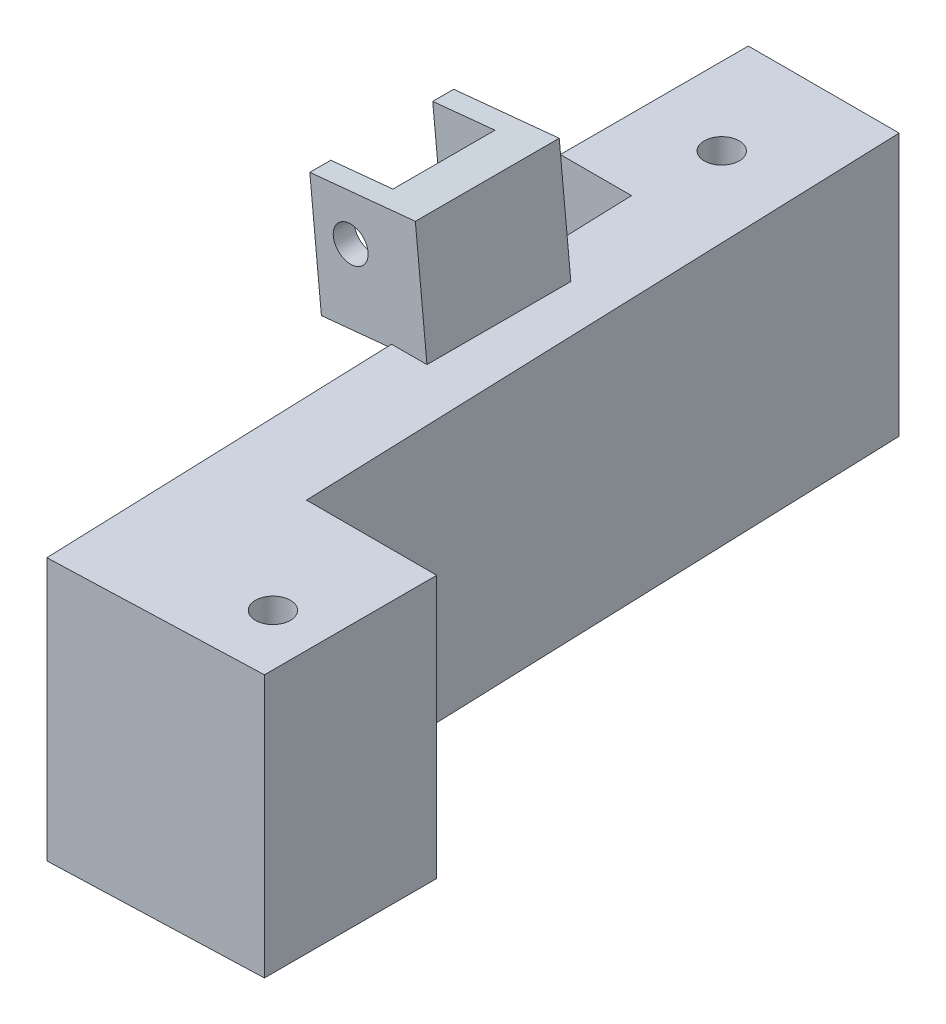
ISO-10303-21;
HEADER;
FILE_DESCRIPTION(('STEP AP214'),'2;1');
FILE_NAME('part.step','',(''),(''),'','','');
FILE_SCHEMA(('AUTOMOTIVE_DESIGN { 1 0 10303 214 1 1 1 1 }'));
ENDSEC;
DATA;
#1=APPLICATION_CONTEXT('core data for automotive mechanical design processes');
#2=APPLICATION_PROTOCOL_DEFINITION('international standard','automotive_design',2000,#1);
#3=PRODUCT_CONTEXT('',#1,'mechanical');
#4=PRODUCT('Part','Part','',(#3));
#5=PRODUCT_RELATED_PRODUCT_CATEGORY('part','',(#4));
#6=PRODUCT_DEFINITION_FORMATION('','',#4);
#7=PRODUCT_DEFINITION_CONTEXT('part definition',#1,'design');
#8=PRODUCT_DEFINITION('design','',#6,#7);
#9=PRODUCT_DEFINITION_SHAPE('','',#8);
#10=(LENGTH_UNIT() NAMED_UNIT(*) SI_UNIT(.MILLI.,.METRE.));
#11=(NAMED_UNIT(*) PLANE_ANGLE_UNIT() SI_UNIT($,.RADIAN.));
#12=(NAMED_UNIT(*) SI_UNIT($,.STERADIAN.) SOLID_ANGLE_UNIT());
#13=UNCERTAINTY_MEASURE_WITH_UNIT(LENGTH_MEASURE(1.E-05),#10,'distance_accuracy_value','');
#14=(GEOMETRIC_REPRESENTATION_CONTEXT(3) GLOBAL_UNCERTAINTY_ASSIGNED_CONTEXT((#13)) GLOBAL_UNIT_ASSIGNED_CONTEXT((#10,
#11,#12)) REPRESENTATION_CONTEXT('',''));
#15=CARTESIAN_POINT('',(0.,0.,0.));
#16=DIRECTION('',(0.,0.,1.));
#17=DIRECTION('',(1.,0.,0.));
#18=AXIS2_PLACEMENT_3D('',#15,#16,#17);
#19=CARTESIAN_POINT('',(484.354931301938,150.999999999998,22.352));
#20=DIRECTION('',(0.,0.,-1.));
#21=DIRECTION('',(1.,0.,0.));
#22=AXIS2_PLACEMENT_3D('',#19,#20,#21);
#23=CYLINDRICAL_SURFACE('',#22,9.52499999999996);
#24=CARTESIAN_POINT('',(484.354931301938,150.999999999998,18.542));
#25=DIRECTION('',(0.,0.,-1.));
#26=DIRECTION('',(-1.,0.,0.));
#27=AXIS2_PLACEMENT_3D('',#24,#25,#26);
#28=CIRCLE('',#27,9.52499999999996);
#29=CARTESIAN_POINT('',(485.284620904235,141.520479851626,18.542));
#30=VERTEX_POINT('',#29);
#31=CARTESIAN_POINT('',(488.231748541954,159.700339825977,18.542));
#32=VERTEX_POINT('',#31);
#33=EDGE_CURVE('E303',#30,#32,#28,.F.);
#34=ORIENTED_EDGE('',*,*,#33,.T.);
#35=DIRECTION('',(0.,0.,-1.));
#36=VECTOR('',#35,1.);
#37=CARTESIAN_POINT('',(488.231748541954,159.700339825977,22.3519999999996));
#38=LINE('',#37,#36);
#39=CARTESIAN_POINT('',(488.231748541954,159.700339825977,-4.44089209850063E-13));
#40=VERTEX_POINT('',#39);
#41=EDGE_CURVE('E339',#32,#40,#38,.T.);
#42=ORIENTED_EDGE('',*,*,#41,.T.);
#43=CARTESIAN_POINT('',(484.354931301938,150.999999999998,0.));
#44=DIRECTION('',(0.,0.,1.));
#45=DIRECTION('',(1.,0.,0.));
#46=AXIS2_PLACEMENT_3D('',#43,#44,#45);
#47=CIRCLE('',#46,9.52499999999996);
#48=CARTESIAN_POINT('',(485.284620904235,141.520479851626,0.));
#49=VERTEX_POINT('',#48);
#50=EDGE_CURVE('E317',#49,#40,#47,.T.);
#51=ORIENTED_EDGE('',*,*,#50,.F.);
#52=DIRECTION('',(0.,0.,-1.));
#53=VECTOR('',#52,1.);
#54=CARTESIAN_POINT('',(485.284620904235,141.520479851626,22.352));
#55=LINE('',#54,#53);
#56=EDGE_CURVE('E332',#30,#49,#55,.T.);
#57=ORIENTED_EDGE('',*,*,#56,.F.);
#58=EDGE_LOOP('',(#34,#42,#51,#57));
#59=FACE_BOUND('',#58,.T.);
#60=ADVANCED_FACE('F49',(#59),#23,.F.);
#61=CARTESIAN_POINT('',(-9.12398287906912,93.0321037493748,22.352));
#62=DIRECTION('',(-0.0976052075901502,0.99522521242746,0.));
#63=DIRECTION('',(-0.99522521242746,-0.0976052075901502,0.));
#64=AXIS2_PLACEMENT_3D('',#61,#62,#63);
#65=PLANE('',#64);
#66=ORIENTED_EDGE('',*,*,#56,.T.);
#67=DIRECTION('',(-0.995225212427461,-0.0976052075901502,0.));
#68=VECTOR('',#67,1.);
#69=CARTESIAN_POINT('',(-9.12398287906912,93.0321037493748,0.));
#70=LINE('',#69,#68);
#71=CARTESIAN_POINT('',(478.661596160572,140.870936716155,0.));
#72=VERTEX_POINT('',#71);
#73=EDGE_CURVE('E322',#49,#72,#70,.T.);
#74=ORIENTED_EDGE('',*,*,#73,.T.);
#75=DIRECTION('',(0.,0.,-1.));
#76=VECTOR('',#75,1.);
#77=CARTESIAN_POINT('',(478.661596160572,140.870936716155,22.352));
#78=LINE('',#77,#76);
#79=CARTESIAN_POINT('',(478.661596160572,140.870936716155,18.542));
#80=VERTEX_POINT('',#79);
#81=EDGE_CURVE('E355',#80,#72,#78,.T.);
#82=ORIENTED_EDGE('',*,*,#81,.F.);
#83=DIRECTION('',(0.995225212427461,0.0976052075901502,0.));
#84=VECTOR('',#83,1.);
#85=CARTESIAN_POINT('',(-9.12398287906916,93.0321037493748,18.542));
#86=LINE('',#85,#84);
#87=EDGE_CURVE('E307',#80,#30,#86,.T.);
#88=ORIENTED_EDGE('',*,*,#87,.T.);
#89=EDGE_LOOP('',(#66,#74,#82,#88));
#90=FACE_BOUND('',#89,.T.);
#91=ADVANCED_FACE('F388',(#90),#65,.T.);
#92=CARTESIAN_POINT('',(-10.861882642295,110.752486746728,22.352));
#93=DIRECTION('',(-0.0976052075901548,0.99522521242746,0.));
#94=DIRECTION('',(-0.99522521242746,-0.0976052075901548,0.));
#95=AXIS2_PLACEMENT_3D('',#92,#93,#94);
#96=PLANE('',#95);
#97=ORIENTED_EDGE('',*,*,#41,.F.);
#98=DIRECTION('',(-0.99522521242746,-0.0976052075901545,0.));
#99=VECTOR('',#98,1.);
#100=CARTESIAN_POINT('',(-10.8618826422951,110.752486746729,18.542));
#101=LINE('',#100,#99);
#102=CARTESIAN_POINT('',(476.923696397346,158.591319713511,18.542));
#103=VERTEX_POINT('',#102);
#104=EDGE_CURVE('E299',#32,#103,#101,.T.);
#105=ORIENTED_EDGE('',*,*,#104,.T.);
#106=DIRECTION('',(0.,0.,1.));
#107=VECTOR('',#106,1.);
#108=CARTESIAN_POINT('',(476.923696397346,158.591319713511,18.542));
#109=LINE('',#108,#107);
#110=CARTESIAN_POINT('',(476.923696397346,158.591319713511,22.352));
#111=VERTEX_POINT('',#110);
#112=EDGE_CURVE('E310',#103,#111,#109,.T.);
#113=ORIENTED_EDGE('',*,*,#112,.T.);
#114=DIRECTION('',(-0.99522521242746,-0.0976052075901548,0.));
#115=VECTOR('',#114,1.);
#116=CARTESIAN_POINT('',(-10.861882642295,110.752486746728,22.352));
#117=LINE('',#116,#115);
#118=CARTESIAN_POINT('',(496.114951182073,160.473473002825,22.352));
#119=VERTEX_POINT('',#118);
#120=EDGE_CURVE('E328',#119,#111,#117,.T.);
#121=ORIENTED_EDGE('',*,*,#120,.F.);
#122=DIRECTION('',(0.,0.,-1.));
#123=VECTOR('',#122,1.);
#124=CARTESIAN_POINT('',(496.114951182073,160.473473002825,22.352));
#125=LINE('',#124,#123);
#126=CARTESIAN_POINT('',(496.114951182073,160.473473002825,-3.81));
#127=VERTEX_POINT('',#126);
#128=EDGE_CURVE('E343',#119,#127,#125,.T.);
#129=ORIENTED_EDGE('',*,*,#128,.T.);
#130=DIRECTION('',(-0.99522521242746,-0.0976052075901565,0.));
#131=VECTOR('',#130,1.);
#132=CARTESIAN_POINT('',(-10.8618826422952,110.752486746728,-3.81));
#133=LINE('',#132,#131);
#134=CARTESIAN_POINT('',(476.923696397346,158.591319713511,-3.81));
#135=VERTEX_POINT('',#134);
#136=EDGE_CURVE('E267',#127,#135,#133,.T.);
#137=ORIENTED_EDGE('',*,*,#136,.T.);
#138=DIRECTION('',(0.,0.,1.));
#139=VECTOR('',#138,1.);
#140=CARTESIAN_POINT('',(476.923696397346,158.591319713511,-3.81));
#141=LINE('',#140,#139);
#142=CARTESIAN_POINT('',(476.923696397346,158.591319713511,0.));
#143=VERTEX_POINT('',#142);
#144=EDGE_CURVE('E278',#135,#143,#141,.T.);
#145=ORIENTED_EDGE('',*,*,#144,.T.);
#146=DIRECTION('',(-0.99522521242746,-0.0976052075901565,0.));
#147=VECTOR('',#146,1.);
#148=CARTESIAN_POINT('',(-10.8618826422952,110.752486746728,0.));
#149=LINE('',#148,#147);
#150=EDGE_CURVE('E282',#40,#143,#149,.T.);
#151=ORIENTED_EDGE('',*,*,#150,.F.);
#152=EDGE_LOOP('',(#97,#105,#113,#121,#129,#137,#145,#151));
#153=FACE_BOUND('',#152,.T.);
#154=ADVANCED_FACE('F393',(#153),#96,.T.);
#155=CARTESIAN_POINT('',(506.976833824368,49.7209862560963,22.352));
#156=DIRECTION('',(0.99522521242746,0.0976052075901537,0.));
#157=DIRECTION('',(-0.0976052075901537,0.99522521242746,0.));
#158=AXIS2_PLACEMENT_3D('',#155,#156,#157);
#159=PLANE('',#158);
#160=ORIENTED_EDGE('',*,*,#128,.F.);
#161=DIRECTION('',(-0.0976052075901537,0.99522521242746,0.));
#162=VECTOR('',#161,1.);
#163=CARTESIAN_POINT('',(506.976833824368,49.7209862560963,22.352));
#164=LINE('',#163,#162);
#165=CARTESIAN_POINT('',(498.224726786217,138.961281946121,22.3520000000004));
#166=VERTEX_POINT('',#165);
#167=EDGE_CURVE('E325',#166,#119,#164,.T.);
#168=ORIENTED_EDGE('',*,*,#167,.F.);
#169=DIRECTION('',(0.,0.,-1.));
#170=VECTOR('',#169,1.);
#171=CARTESIAN_POINT('',(498.224726786217,138.961281946121,22.3520000000004));
#172=LINE('',#171,#170);
#173=CARTESIAN_POINT('',(498.224726786217,138.961281946121,-3.81));
#174=VERTEX_POINT('',#173);
#175=EDGE_CURVE('E347',#166,#174,#172,.T.);
#176=ORIENTED_EDGE('',*,*,#175,.T.);
#177=DIRECTION('',(-0.0976052075901537,0.99522521242746,0.));
#178=VECTOR('',#177,1.);
#179=CARTESIAN_POINT('',(506.976833824368,49.7209862560963,-3.81));
#180=LINE('',#179,#178);
#181=EDGE_CURVE('E263',#174,#127,#180,.T.);
#182=ORIENTED_EDGE('',*,*,#181,.T.);
#183=EDGE_LOOP('',(#160,#168,#176,#182));
#184=FACE_BOUND('',#183,.T.);
#185=ADVANCED_FACE('F418',(#184),#159,.T.);
#186=CARTESIAN_POINT('',(-8.75210703815077,89.2402956900246,22.352));
#187=DIRECTION('',(0.0976052075901534,-0.99522521242746,0.));
#188=DIRECTION('',(0.99522521242746,0.0976052075901534,0.));
#189=AXIS2_PLACEMENT_3D('',#186,#187,#188);
#190=PLANE('',#189);
#191=DIRECTION('',(0.035071956284052,0.00343962907184407,0.999378870516211));
#192=VECTOR('',#191,1.);
#193=CARTESIAN_POINT('',(491.171206664463,138.269518627499,4.63906703094641));
#194=LINE('',#193,#192);
#195=CARTESIAN_POINT('',(490.874697184133,138.240438908638,-3.81));
#196=VERTEX_POINT('',#195);
#197=CARTESIAN_POINT('',(491.792819977573,138.330482413091,22.352));
#198=VERTEX_POINT('',#197);
#199=EDGE_CURVE('E249',#196,#198,#194,.T.);
#200=ORIENTED_EDGE('',*,*,#199,.T.);
#201=DIRECTION('',(0.99522521242746,0.0976052075901534,0.));
#202=VECTOR('',#201,1.);
#203=CARTESIAN_POINT('',(-8.75210703815077,89.2402956900246,22.352));
#204=LINE('',#203,#202);
#205=CARTESIAN_POINT('',(479.033472001491,137.079128656807,22.352));
#206=VERTEX_POINT('',#205);
#207=EDGE_CURVE('E321',#206,#198,#204,.T.);
#208=ORIENTED_EDGE('',*,*,#207,.F.);
#209=DIRECTION('',(0.,0.,-1.));
#210=VECTOR('',#209,1.);
#211=CARTESIAN_POINT('',(479.033472001491,137.079128656807,22.352));
#212=LINE('',#211,#210);
#213=CARTESIAN_POINT('',(479.033472001491,137.079128656807,-3.81));
#214=VERTEX_POINT('',#213);
#215=EDGE_CURVE('E351',#206,#214,#212,.T.);
#216=ORIENTED_EDGE('',*,*,#215,.T.);
#217=DIRECTION('',(0.99522521242746,0.0976052075901534,0.));
#218=VECTOR('',#217,1.);
#219=CARTESIAN_POINT('',(-8.75210703815082,89.2402956900246,-3.81));
#220=LINE('',#219,#218);
#221=EDGE_CURVE('E274',#214,#196,#220,.T.);
#222=ORIENTED_EDGE('',*,*,#221,.T.);
#223=EDGE_LOOP('',(#200,#208,#216,#222));
#224=FACE_BOUND('',#223,.T.);
#225=ADVANCED_FACE('F370',(#224),#190,.T.);
#226=CARTESIAN_POINT('',(487.785579039642,47.8388329667822,22.352));
#227=DIRECTION('',(-0.99522521242746,-0.0976052075901538,0.));
#228=DIRECTION('',(0.0976052075901538,-0.99522521242746,0.));
#229=AXIS2_PLACEMENT_3D('',#226,#227,#228);
#230=PLANE('',#229);
#231=ORIENTED_EDGE('',*,*,#215,.F.);
#232=DIRECTION('',(0.0976052075901538,-0.99522521242746,0.));
#233=VECTOR('',#232,1.);
#234=CARTESIAN_POINT('',(487.785579039642,47.8388329667822,22.352));
#235=LINE('',#234,#233);
#236=EDGE_CURVE('E318',#111,#206,#235,.T.);
#237=ORIENTED_EDGE('',*,*,#236,.F.);
#238=ORIENTED_EDGE('',*,*,#112,.F.);
#239=DIRECTION('',(0.0976052075901549,-0.99522521242746,0.));
#240=VECTOR('',#239,1.);
#241=CARTESIAN_POINT('',(487.785579039642,47.8388329667827,18.542));
#242=LINE('',#241,#240);
#243=EDGE_CURVE('E296',#103,#80,#242,.T.);
#244=ORIENTED_EDGE('',*,*,#243,.T.);
#245=ORIENTED_EDGE('',*,*,#81,.T.);
#246=DIRECTION('',(0.0976052075901615,-0.995225212427459,0.));
#247=VECTOR('',#246,1.);
#248=CARTESIAN_POINT('',(487.785579039642,47.838832966786,0.));
#249=LINE('',#248,#247);
#250=EDGE_CURVE('E264',#143,#72,#249,.T.);
#251=ORIENTED_EDGE('',*,*,#250,.F.);
#252=ORIENTED_EDGE('',*,*,#144,.F.);
#253=DIRECTION('',(0.0976052075901615,-0.995225212427459,0.));
#254=VECTOR('',#253,1.);
#255=CARTESIAN_POINT('',(487.785579039642,47.838832966786,-3.81));
#256=LINE('',#255,#254);
#257=EDGE_CURVE('E271',#135,#214,#256,.T.);
#258=ORIENTED_EDGE('',*,*,#257,.T.);
#259=EDGE_LOOP('',(#231,#237,#238,#244,#245,#251,#252,#258));
#260=FACE_BOUND('',#259,.T.);
#261=ADVANCED_FACE('F409',(#260),#230,.T.);
#262=CARTESIAN_POINT('',(0.,0.,22.352));
#263=DIRECTION('',(0.,0.,-1.));
#264=DIRECTION('',(1.,0.,0.));
#265=AXIS2_PLACEMENT_3D('',#262,#263,#264);
#266=PLANE('',#265);
#267=ORIENTED_EDGE('',*,*,#167,.T.);
#268=ORIENTED_EDGE('',*,*,#120,.T.);
#269=ORIENTED_EDGE('',*,*,#236,.T.);
#270=ORIENTED_EDGE('',*,*,#207,.T.);
#271=DIRECTION('',(0.,-1.,0.));
#272=VECTOR('',#271,1.);
#273=CARTESIAN_POINT('',(491.792819977573,-3.70275009174436E-13,22.352));
#274=LINE('',#273,#272);
#275=CARTESIAN_POINT('',(491.792819977573,138.961281946121,22.352));
#276=VERTEX_POINT('',#275);
#277=EDGE_CURVE('E69',#276,#198,#274,.T.);
#278=ORIENTED_EDGE('',*,*,#277,.F.);
#279=DIRECTION('',(-1.,0.,0.));
#280=VECTOR('',#279,1.);
#281=CARTESIAN_POINT('',(0.,138.961281946121,22.352));
#282=LINE('',#281,#280);
#283=EDGE_CURVE('E255',#166,#276,#282,.T.);
#284=ORIENTED_EDGE('',*,*,#283,.F.);
#285=EDGE_LOOP('',(#267,#268,#269,#270,#278,#284));
#286=FACE_BOUND('',#285,.T.);
#287=CARTESIAN_POINT('',(484.354931301938,150.999999999998,22.352));
#288=DIRECTION('',(0.,0.,-1.));
#289=DIRECTION('',(-1.,0.,0.));
#290=AXIS2_PLACEMENT_3D('',#287,#288,#289);
#291=CIRCLE('',#290,3.17499999999997);
#292=CARTESIAN_POINT('',(484.354931301938,154.174999999998,22.352));
#293=VERTEX_POINT('',#292);
#294=EDGE_CURVE('E291',#293,#293,#291,.T.);
#295=ORIENTED_EDGE('',*,*,#294,.T.);
#296=EDGE_LOOP('',(#295));
#297=FACE_BOUND('',#296,.T.);
#298=ADVANCED_FACE('F413',(#286,#297),#266,.F.);
#299=CARTESIAN_POINT('',(484.354931301938,150.999999999998,18.542));
#300=DIRECTION('',(0.,0.,1.));
#301=DIRECTION('',(0.,1.,0.));
#302=AXIS2_PLACEMENT_3D('',#299,#300,#301);
#303=CYLINDRICAL_SURFACE('',#302,3.17499999999997);
#304=CARTESIAN_POINT('',(484.354931301938,150.999999999998,18.542));
#305=DIRECTION('',(0.,0.,-1.));
#306=DIRECTION('',(-1.,0.,0.));
#307=AXIS2_PLACEMENT_3D('',#304,#305,#306);
#308=CIRCLE('',#307,3.17499999999997);
#309=CARTESIAN_POINT('',(484.354931301938,154.174999999998,18.542));
#310=VERTEX_POINT('',#309);
#311=EDGE_CURVE('E292',#310,#310,#308,.T.);
#312=CARTESIAN_POINT('',(484.354931301938,154.174999999998,18.542));
#313=CARTESIAN_POINT('',(484.354931301938,154.174999999998,18.5816875));
#314=CARTESIAN_POINT('',(484.354931301938,154.174999999998,18.621375));
#315=CARTESIAN_POINT('',(484.354931301938,154.174999999998,18.70075));
#316=CARTESIAN_POINT('',(484.354931301938,154.174999999998,18.7404375));
#317=CARTESIAN_POINT('',(484.354931301938,154.174999999998,18.8198125));
#318=CARTESIAN_POINT('',(484.354931301938,154.174999999998,18.8595));
#319=CARTESIAN_POINT('',(484.354931301938,154.174999999998,18.938875));
#320=CARTESIAN_POINT('',(484.354931301938,154.174999999998,18.9785625));
#321=CARTESIAN_POINT('',(484.354931301938,154.174999999998,19.0579375));
#322=CARTESIAN_POINT('',(484.354931301938,154.174999999998,19.097625));
#323=CARTESIAN_POINT('',(484.354931301938,154.174999999998,19.177));
#324=CARTESIAN_POINT('',(484.354931301938,154.174999999998,19.2166875));
#325=CARTESIAN_POINT('',(484.354931301938,154.174999999998,19.2960625));
#326=CARTESIAN_POINT('',(484.354931301938,154.174999999998,19.33575));
#327=CARTESIAN_POINT('',(484.354931301938,154.174999999998,19.415125));
#328=CARTESIAN_POINT('',(484.354931301938,154.174999999998,19.4548125));
#329=CARTESIAN_POINT('',(484.354931301938,154.174999999998,19.5341875));
#330=CARTESIAN_POINT('',(484.354931301938,154.174999999998,19.573875));
#331=CARTESIAN_POINT('',(484.354931301938,154.174999999998,19.65325));
#332=CARTESIAN_POINT('',(484.354931301938,154.174999999998,19.6929375));
#333=CARTESIAN_POINT('',(484.354931301938,154.174999999998,19.7723125));
#334=CARTESIAN_POINT('',(484.354931301938,154.174999999998,19.812));
#335=CARTESIAN_POINT('',(484.354931301938,154.174999999998,19.891375));
#336=CARTESIAN_POINT('',(484.354931301938,154.174999999998,19.9310625));
#337=CARTESIAN_POINT('',(484.354931301938,154.174999999998,20.0104375));
#338=CARTESIAN_POINT('',(484.354931301938,154.174999999998,20.050125));
#339=CARTESIAN_POINT('',(484.354931301938,154.174999999998,20.1295));
#340=CARTESIAN_POINT('',(484.354931301938,154.174999999998,20.1691875));
#341=CARTESIAN_POINT('',(484.354931301938,154.174999999998,20.2485625));
#342=CARTESIAN_POINT('',(484.354931301938,154.174999999998,20.28825));
#343=CARTESIAN_POINT('',(484.354931301938,154.174999999998,20.367625));
#344=CARTESIAN_POINT('',(484.354931301938,154.174999999998,20.4073125));
#345=CARTESIAN_POINT('',(484.354931301938,154.174999999998,20.4866875));
#346=CARTESIAN_POINT('',(484.354931301938,154.174999999998,20.526375));
#347=CARTESIAN_POINT('',(484.354931301938,154.174999999998,20.60575));
#348=CARTESIAN_POINT('',(484.354931301938,154.174999999998,20.6454375));
#349=CARTESIAN_POINT('',(484.354931301938,154.174999999998,20.7248125));
#350=CARTESIAN_POINT('',(484.354931301938,154.174999999998,20.7645));
#351=CARTESIAN_POINT('',(484.354931301938,154.174999999998,20.843875));
#352=CARTESIAN_POINT('',(484.354931301938,154.174999999998,20.8835625));
#353=CARTESIAN_POINT('',(484.354931301938,154.174999999998,20.9629375));
#354=CARTESIAN_POINT('',(484.354931301938,154.174999999998,21.002625));
#355=CARTESIAN_POINT('',(484.354931301938,154.174999999998,21.082));
#356=CARTESIAN_POINT('',(484.354931301938,154.174999999998,21.1216875));
#357=CARTESIAN_POINT('',(484.354931301938,154.174999999998,21.2010625));
#358=CARTESIAN_POINT('',(484.354931301938,154.174999999998,21.24075));
#359=CARTESIAN_POINT('',(484.354931301938,154.174999999998,21.320125));
#360=CARTESIAN_POINT('',(484.354931301938,154.174999999998,21.3598125));
#361=CARTESIAN_POINT('',(484.354931301938,154.174999999998,21.4391875));
#362=CARTESIAN_POINT('',(484.354931301938,154.174999999998,21.478875));
#363=CARTESIAN_POINT('',(484.354931301938,154.174999999998,21.55825));
#364=CARTESIAN_POINT('',(484.354931301938,154.174999999998,21.5979375));
#365=CARTESIAN_POINT('',(484.354931301938,154.174999999998,21.6773125));
#366=CARTESIAN_POINT('',(484.354931301938,154.174999999998,21.717));
#367=CARTESIAN_POINT('',(484.354931301938,154.174999999998,21.796375));
#368=CARTESIAN_POINT('',(484.354931301938,154.174999999998,21.8360625));
#369=CARTESIAN_POINT('',(484.354931301938,154.174999999998,21.9154375));
#370=CARTESIAN_POINT('',(484.354931301938,154.174999999998,21.955125));
#371=CARTESIAN_POINT('',(484.354931301938,154.174999999998,22.0345));
#372=CARTESIAN_POINT('',(484.354931301938,154.174999999998,22.0741875));
#373=CARTESIAN_POINT('',(484.354931301938,154.174999999998,22.1535625));
#374=CARTESIAN_POINT('',(484.354931301938,154.174999999998,22.19325));
#375=CARTESIAN_POINT('',(484.354931301938,154.174999999998,22.272625));
#376=CARTESIAN_POINT('',(484.354931301938,154.174999999998,22.3123125));
#377=CARTESIAN_POINT('',(484.354931301938,154.174999999998,22.352));
#378=B_SPLINE_CURVE_WITH_KNOTS('',3,(#312,#313,#314,#315,#316,#317,#318,#319,#320,#321,#322,
#323,#324,#325,#326,#327,#328,#329,#330,#331,#332,#333,#334,#335,#336,#337,#338,#339,#340,#341,
#342,#343,#344,#345,#346,#347,#348,#349,#350,#351,#352,#353,#354,#355,#356,#357,#358,#359,#360,
#361,#362,#363,#364,#365,#366,#367,#368,#369,#370,#371,#372,#373,#374,#375,#376,#377),
.UNSPECIFIED.,.F.,.F.,(4,2,2,2,2,2,2,2,2,2,2,2,2,2,2,2,2,2,2,2,2,2,2,2,2,2,2,2,2,2,2,2,4),(0.,
0.119062500000003,0.238125000000002,0.357187500000002,0.476250000000001,0.5953125,
0.714375000000003,0.833437500000003,0.952500000000002,1.0715625,1.190625,1.3096875,1.42875,
1.5478125,1.666875,1.7859375,1.905,2.0240625,2.143125,2.2621875,2.38125,2.5003125,2.619375,
2.7384375,2.8575,2.9765625,3.095625,3.2146875,3.33375,3.4528125,3.571875,3.6909375,3.81),.UNSPECIFIED.);
#379=EDGE_CURVE('BSEAM507',#310,#293,#378,.T.);
#380=ORIENTED_EDGE('',*,*,#311,.T.);
#381=ORIENTED_EDGE('',*,*,#294,.F.);
#382=ORIENTED_EDGE('',*,*,#379,.T.);
#383=ORIENTED_EDGE('',*,*,#379,.F.);
#384=EDGE_LOOP('',(#380,#382,#381,#383));
#385=FACE_BOUND('',#384,.T.);
#386=ADVANCED_FACE('F507',(#385),#303,.F.);
#387=CARTESIAN_POINT('',(0.,0.,18.542));
#388=DIRECTION('',(0.,0.,1.));
#389=DIRECTION('',(-1.,0.,0.));
#390=AXIS2_PLACEMENT_3D('',#387,#388,#389);
#391=PLANE('',#390);
#392=ORIENTED_EDGE('',*,*,#311,.F.);
#393=EDGE_LOOP('',(#392));
#394=FACE_BOUND('',#393,.T.);
#395=ORIENTED_EDGE('',*,*,#243,.F.);
#396=ORIENTED_EDGE('',*,*,#104,.F.);
#397=ORIENTED_EDGE('',*,*,#33,.F.);
#398=ORIENTED_EDGE('',*,*,#87,.F.);
#399=EDGE_LOOP('',(#395,#396,#397,#398));
#400=FACE_BOUND('',#399,.T.);
#401=ADVANCED_FACE('F401',(#394,#400),#391,.F.);
#402=CARTESIAN_POINT('',(484.354931301938,150.999999999998,-3.81));
#403=DIRECTION('',(0.,0.,1.));
#404=DIRECTION('',(-1.,0.,0.));
#405=AXIS2_PLACEMENT_3D('',#402,#403,#404);
#406=CYLINDRICAL_SURFACE('',#405,3.17499999999997);
#407=CARTESIAN_POINT('',(484.354931301938,150.999999999998,-3.81));
#408=DIRECTION('',(0.,0.,1.));
#409=DIRECTION('',(1.,0.,0.));
#410=AXIS2_PLACEMENT_3D('',#407,#408,#409);
#411=CIRCLE('',#410,3.17499999999997);
#412=CARTESIAN_POINT('',(481.179931301938,150.999999999998,-3.81));
#413=VERTEX_POINT('',#412);
#414=EDGE_CURVE('E259',#413,#413,#411,.T.);
#415=CARTESIAN_POINT('',(484.354931301938,150.999999999998,0.));
#416=DIRECTION('',(0.,0.,1.));
#417=DIRECTION('',(1.,0.,0.));
#418=AXIS2_PLACEMENT_3D('',#415,#416,#417);
#419=CIRCLE('',#418,3.17499999999997);
#420=CARTESIAN_POINT('',(481.179931301938,150.999999999998,0.));
#421=VERTEX_POINT('',#420);
#422=EDGE_CURVE('E258',#421,#421,#419,.T.);
#423=CARTESIAN_POINT('',(481.179931301938,150.999999999998,-3.81));
#424=CARTESIAN_POINT('',(481.179931301938,150.999999999998,-3.7703125));
#425=CARTESIAN_POINT('',(481.179931301938,150.999999999998,-3.730625));
#426=CARTESIAN_POINT('',(481.179931301938,150.999999999998,-3.65125));
#427=CARTESIAN_POINT('',(481.179931301938,150.999999999998,-3.6115625));
#428=CARTESIAN_POINT('',(481.179931301938,150.999999999998,-3.5321875));
#429=CARTESIAN_POINT('',(481.179931301938,150.999999999998,-3.4925));
#430=CARTESIAN_POINT('',(481.179931301938,150.999999999998,-3.413125));
#431=CARTESIAN_POINT('',(481.179931301938,150.999999999998,-3.3734375));
#432=CARTESIAN_POINT('',(481.179931301938,150.999999999998,-3.2940625));
#433=CARTESIAN_POINT('',(481.179931301938,150.999999999998,-3.254375));
#434=CARTESIAN_POINT('',(481.179931301938,150.999999999998,-3.175));
#435=CARTESIAN_POINT('',(481.179931301938,150.999999999998,-3.1353125));
#436=CARTESIAN_POINT('',(481.179931301938,150.999999999998,-3.0559375));
#437=CARTESIAN_POINT('',(481.179931301938,150.999999999998,-3.01625));
#438=CARTESIAN_POINT('',(481.179931301938,150.999999999998,-2.936875));
#439=CARTESIAN_POINT('',(481.179931301938,150.999999999998,-2.8971875));
#440=CARTESIAN_POINT('',(481.179931301938,150.999999999998,-2.8178125));
#441=CARTESIAN_POINT('',(481.179931301938,150.999999999998,-2.778125));
#442=CARTESIAN_POINT('',(481.179931301938,150.999999999998,-2.69875));
#443=CARTESIAN_POINT('',(481.179931301938,150.999999999998,-2.6590625));
#444=CARTESIAN_POINT('',(481.179931301938,150.999999999998,-2.5796875));
#445=CARTESIAN_POINT('',(481.179931301938,150.999999999998,-2.54));
#446=CARTESIAN_POINT('',(481.179931301938,150.999999999998,-2.460625));
#447=CARTESIAN_POINT('',(481.179931301938,150.999999999998,-2.4209375));
#448=CARTESIAN_POINT('',(481.179931301938,150.999999999998,-2.3415625));
#449=CARTESIAN_POINT('',(481.179931301938,150.999999999998,-2.301875));
#450=CARTESIAN_POINT('',(481.179931301938,150.999999999998,-2.2225));
#451=CARTESIAN_POINT('',(481.179931301938,150.999999999998,-2.1828125));
#452=CARTESIAN_POINT('',(481.179931301938,150.999999999998,-2.1034375));
#453=CARTESIAN_POINT('',(481.179931301938,150.999999999998,-2.06375));
#454=CARTESIAN_POINT('',(481.179931301938,150.999999999998,-1.984375));
#455=CARTESIAN_POINT('',(481.179931301938,150.999999999998,-1.9446875));
#456=CARTESIAN_POINT('',(481.179931301938,150.999999999998,-1.8653125));
#457=CARTESIAN_POINT('',(481.179931301938,150.999999999998,-1.825625));
#458=CARTESIAN_POINT('',(481.179931301938,150.999999999998,-1.74625));
#459=CARTESIAN_POINT('',(481.179931301938,150.999999999998,-1.7065625));
#460=CARTESIAN_POINT('',(481.179931301938,150.999999999998,-1.6271875));
#461=CARTESIAN_POINT('',(481.179931301938,150.999999999998,-1.5875));
#462=CARTESIAN_POINT('',(481.179931301938,150.999999999998,-1.508125));
#463=CARTESIAN_POINT('',(481.179931301938,150.999999999998,-1.4684375));
#464=CARTESIAN_POINT('',(481.179931301938,150.999999999998,-1.3890625));
#465=CARTESIAN_POINT('',(481.179931301938,150.999999999998,-1.349375));
#466=CARTESIAN_POINT('',(481.179931301938,150.999999999998,-1.27));
#467=CARTESIAN_POINT('',(481.179931301938,150.999999999998,-1.2303125));
#468=CARTESIAN_POINT('',(481.179931301938,150.999999999998,-1.1509375));
#469=CARTESIAN_POINT('',(481.179931301938,150.999999999998,-1.11125));
#470=CARTESIAN_POINT('',(481.179931301938,150.999999999998,-1.031875));
#471=CARTESIAN_POINT('',(481.179931301938,150.999999999998,-0.9921875));
#472=CARTESIAN_POINT('',(481.179931301938,150.999999999998,-0.9128125));
#473=CARTESIAN_POINT('',(481.179931301938,150.999999999998,-0.873125));
#474=CARTESIAN_POINT('',(481.179931301938,150.999999999998,-0.79375));
#475=CARTESIAN_POINT('',(481.179931301938,150.999999999998,-0.7540625));
#476=CARTESIAN_POINT('',(481.179931301938,150.999999999998,-0.6746875));
#477=CARTESIAN_POINT('',(481.179931301938,150.999999999998,-0.635));
#478=CARTESIAN_POINT('',(481.179931301938,150.999999999998,-0.555625));
#479=CARTESIAN_POINT('',(481.179931301938,150.999999999998,-0.5159375));
#480=CARTESIAN_POINT('',(481.179931301938,150.999999999998,-0.4365625));
#481=CARTESIAN_POINT('',(481.179931301938,150.999999999998,-0.396875));
#482=CARTESIAN_POINT('',(481.179931301938,150.999999999998,-0.3175));
#483=CARTESIAN_POINT('',(481.179931301938,150.999999999998,-0.2778125));
#484=CARTESIAN_POINT('',(481.179931301938,150.999999999998,-0.1984375));
#485=CARTESIAN_POINT('',(481.179931301938,150.999999999998,-0.15875));
#486=CARTESIAN_POINT('',(481.179931301938,150.999999999998,-0.0793749999999999));
#487=CARTESIAN_POINT('',(481.179931301938,150.999999999998,-0.0396874999999999));
#488=CARTESIAN_POINT('',(481.179931301938,150.999999999998,0.));
#489=B_SPLINE_CURVE_WITH_KNOTS('',3,(#423,#424,#425,#426,#427,#428,#429,#430,#431,#432,#433,
#434,#435,#436,#437,#438,#439,#440,#441,#442,#443,#444,#445,#446,#447,#448,#449,#450,#451,#452,
#453,#454,#455,#456,#457,#458,#459,#460,#461,#462,#463,#464,#465,#466,#467,#468,#469,#470,#471,
#472,#473,#474,#475,#476,#477,#478,#479,#480,#481,#482,#483,#484,#485,#486,#487,#488),
.UNSPECIFIED.,.F.,.F.,(4,2,2,2,2,2,2,2,2,2,2,2,2,2,2,2,2,2,2,2,2,2,2,2,2,2,2,2,2,2,2,2,4),(0.,
0.1190625,0.238125,0.3571875,0.47625,0.5953125,0.714375,0.833437499999999,0.9525,1.0715625,
1.190625,1.3096875,1.42875,1.5478125,1.666875,1.7859375,1.905,2.0240625,2.143125,2.2621875,
2.38125,2.5003125,2.619375,2.7384375,2.8575,2.9765625,3.095625,3.2146875,3.33375,3.4528125,
3.571875,3.6909375,3.81),.UNSPECIFIED.);
#490=EDGE_CURVE('BSEAM499',#413,#421,#489,.T.);
#491=ORIENTED_EDGE('',*,*,#414,.F.);
#492=ORIENTED_EDGE('',*,*,#422,.T.);
#493=ORIENTED_EDGE('',*,*,#490,.T.);
#494=ORIENTED_EDGE('',*,*,#490,.F.);
#495=EDGE_LOOP('',(#491,#493,#492,#494));
#496=FACE_BOUND('',#495,.T.);
#497=ADVANCED_FACE('F499',(#496),#406,.F.);
#498=CARTESIAN_POINT('',(0.,0.,-3.81));
#499=DIRECTION('',(0.,0.,-1.));
#500=DIRECTION('',(1.,0.,0.));
#501=AXIS2_PLACEMENT_3D('',#498,#499,#500);
#502=PLANE('',#501);
#503=DIRECTION('',(-1.,0.,0.));
#504=VECTOR('',#503,1.);
#505=CARTESIAN_POINT('',(0.,138.961281946121,-3.81));
#506=LINE('',#505,#504);
#507=CARTESIAN_POINT('',(490.874697184133,138.961281946121,-3.81));
#508=VERTEX_POINT('',#507);
#509=EDGE_CURVE('E11',#174,#508,#506,.T.);
#510=ORIENTED_EDGE('',*,*,#509,.T.);
#511=DIRECTION('',(0.,-1.,0.));
#512=VECTOR('',#511,1.);
#513=CARTESIAN_POINT('',(490.874697184133,-3.69583746691629E-13,-3.81));
#514=LINE('',#513,#512);
#515=EDGE_CURVE('E57',#508,#196,#514,.T.);
#516=ORIENTED_EDGE('',*,*,#515,.T.);
#517=ORIENTED_EDGE('',*,*,#221,.F.);
#518=ORIENTED_EDGE('',*,*,#257,.F.);
#519=ORIENTED_EDGE('',*,*,#136,.F.);
#520=ORIENTED_EDGE('',*,*,#181,.F.);
#521=EDGE_LOOP('',(#510,#516,#517,#518,#519,#520));
#522=FACE_BOUND('',#521,.T.);
#523=ORIENTED_EDGE('',*,*,#414,.T.);
#524=EDGE_LOOP('',(#523));
#525=FACE_BOUND('',#524,.T.);
#526=ADVANCED_FACE('F365',(#522,#525),#502,.T.);
#527=CARTESIAN_POINT('',(0.,0.,0.));
#528=DIRECTION('',(0.,0.,-1.));
#529=DIRECTION('',(1.,0.,0.));
#530=AXIS2_PLACEMENT_3D('',#527,#528,#529);
#531=PLANE('',#530);
#532=ORIENTED_EDGE('',*,*,#50,.T.);
#533=ORIENTED_EDGE('',*,*,#150,.T.);
#534=ORIENTED_EDGE('',*,*,#250,.T.);
#535=ORIENTED_EDGE('',*,*,#73,.F.);
#536=EDGE_LOOP('',(#532,#533,#534,#535));
#537=FACE_BOUND('',#536,.T.);
#538=ORIENTED_EDGE('',*,*,#422,.F.);
#539=EDGE_LOOP('',(#538));
#540=FACE_BOUND('',#539,.T.);
#541=ADVANCED_FACE('F383',(#537,#540),#531,.F.);
#542=CARTESIAN_POINT('',(0.,138.961281946121,-3.88158721593413E-13));
#543=DIRECTION('',(0.,1.,0.));
#544=DIRECTION('',(0.,0.,-1.));
#545=AXIS2_PLACEMENT_3D('',#542,#543,#544);
#546=PLANE('',#545);
#547=CARTESIAN_POINT('',(491.366130703707,138.961281946121,-38.1050659351772));
#548=DIRECTION('',(0.,-1.,0.));
#549=DIRECTION('',(0.,0.,-1.));
#550=AXIS2_PLACEMENT_3D('',#547,#548,#549);
#551=CIRCLE('',#550,3.17500000000009);
#552=CARTESIAN_POINT('',(491.366130703707,138.961281946121,-41.2800659351773));
#553=VERTEX_POINT('',#552);
#554=EDGE_CURVE('E423',#553,#553,#551,.T.);
#555=ORIENTED_EDGE('',*,*,#554,.T.);
#556=EDGE_LOOP('',(#555));
#557=FACE_BOUND('',#556,.T.);
#558=CARTESIAN_POINT('',(522.917143490395,138.961281946121,75.0491676662665));
#559=DIRECTION('',(0.,-1.,0.));
#560=DIRECTION('',(0.,0.,-1.));
#561=AXIS2_PLACEMENT_3D('',#558,#559,#560);
#562=CIRCLE('',#561,3.17500000000008);
#563=CARTESIAN_POINT('',(522.917143490395,138.961281946121,71.8741676662665));
#564=VERTEX_POINT('',#563);
#565=EDGE_CURVE('E427',#564,#564,#562,.T.);
#566=ORIENTED_EDGE('',*,*,#565,.T.);
#567=EDGE_LOOP('',(#566));
#568=FACE_BOUND('',#567,.T.);
#569=ORIENTED_EDGE('',*,*,#283,.T.);
#570=DIRECTION('',(-0.0350721637548947,0.,-0.999384782418439));
#571=VECTOR('',#570,1.);
#572=CARTESIAN_POINT('',(494.072487043271,138.961281946121,87.3113389892222));
#573=LINE('',#572,#571);
#574=CARTESIAN_POINT('',(494.072487043271,138.961281946121,87.3113389892222));
#575=VERTEX_POINT('',#574);
#576=EDGE_CURVE('E64',#575,#276,#573,.T.);
#577=ORIENTED_EDGE('',*,*,#576,.F.);
#578=DIRECTION('',(-0.999384782418439,0.,0.0350721637548908));
#579=VECTOR('',#578,1.);
#580=CARTESIAN_POINT('',(494.072487043271,138.961281946121,87.3113389892222));
#581=LINE('',#580,#579);
#582=CARTESIAN_POINT('',(532.291432121368,138.961281946121,85.9700927306245));
#583=VERTEX_POINT('',#582);
#584=EDGE_CURVE('E200',#583,#575,#581,.T.);
#585=ORIENTED_EDGE('',*,*,#584,.F.);
#586=DIRECTION('',(0.,0.,1.));
#587=VECTOR('',#586,1.);
#588=CARTESIAN_POINT('',(532.291432121368,138.961281946121,85.9700927306245));
#589=LINE('',#588,#587);
#590=CARTESIAN_POINT('',(532.291432121368,138.961281946121,54.6402805446749));
#591=VERTEX_POINT('',#590);
#592=EDGE_CURVE('E204',#591,#583,#589,.T.);
#593=ORIENTED_EDGE('',*,*,#592,.F.);
#594=DIRECTION('',(1.,0.,0.));
#595=VECTOR('',#594,1.);
#596=CARTESIAN_POINT('',(532.291432121368,138.961281946121,54.6402805446749));
#597=LINE('',#596,#595);
#598=CARTESIAN_POINT('',(508.611718184172,138.961281946121,54.6402805446749));
#599=VERTEX_POINT('',#598);
#600=EDGE_CURVE('E441',#599,#591,#597,.T.);
#601=ORIENTED_EDGE('',*,*,#600,.F.);
#602=DIRECTION('',(0.0350721637548938,0.,0.999384782418439));
#603=VECTOR('',#602,1.);
#604=CARTESIAN_POINT('',(508.611718184172,138.961281946121,54.6402805446749));
#605=LINE('',#604,#603);
#606=CARTESIAN_POINT('',(504.692489503563,138.961281946121,-57.0385291686839));
#607=VERTEX_POINT('',#606);
#608=EDGE_CURVE('E445',#607,#599,#605,.T.);
#609=ORIENTED_EDGE('',*,*,#608,.F.);
#610=DIRECTION('',(1.,0.,0.));
#611=VECTOR('',#610,1.);
#612=CARTESIAN_POINT('',(504.692489503563,138.961281946121,-57.0385291686839));
#613=LINE('',#612,#611);
#614=CARTESIAN_POINT('',(477.269374413565,138.961281946121,-57.0385291686839));
#615=VERTEX_POINT('',#614);
#616=EDGE_CURVE('E449',#615,#607,#613,.T.);
#617=ORIENTED_EDGE('',*,*,#616,.F.);
#618=DIRECTION('',(0.,0.,-1.));
#619=VECTOR('',#618,1.);
#620=CARTESIAN_POINT('',(477.269374413565,138.961281946121,-57.0385291686839));
#621=LINE('',#620,#619);
#622=CARTESIAN_POINT('',(477.269374413565,138.961281946121,-22.8599999999999));
#623=VERTEX_POINT('',#622);
#624=EDGE_CURVE('E453',#623,#615,#621,.T.);
#625=ORIENTED_EDGE('',*,*,#624,.F.);
#626=DIRECTION('',(-1.,0.,0.));
#627=VECTOR('',#626,1.);
#628=CARTESIAN_POINT('',(477.269374413565,138.961281946121,-22.8599999999999));
#629=LINE('',#628,#627);
#630=CARTESIAN_POINT('',(490.206161169492,138.961281946121,-22.8599999999999));
#631=VERTEX_POINT('',#630);
#632=EDGE_CURVE('E180',#631,#623,#629,.T.);
#633=ORIENTED_EDGE('',*,*,#632,.F.);
#634=EDGE_CURVE('E421',#508,#631,#573,.T.);
#635=ORIENTED_EDGE('',*,*,#634,.F.);
#636=ORIENTED_EDGE('',*,*,#509,.F.);
#637=ORIENTED_EDGE('',*,*,#175,.F.);
#638=EDGE_LOOP('',(#569,#577,#585,#593,#601,#609,#617,#625,#633,#635,#636,#637));
#639=FACE_BOUND('',#638,.T.);
#640=ADVANCED_FACE('F375',(#557,#568,#639),#546,.T.);
#641=CARTESIAN_POINT('',(494.072487043271,-63.2693796187159,87.3113389892228));
#642=DIRECTION('',(-0.999384782418439,0.,0.0350721637548947));
#643=DIRECTION('',(-0.0350721637548947,0.,-0.999384782418439));
#644=AXIS2_PLACEMENT_3D('',#641,#642,#643);
#645=PLANE('',#644);
#646=ORIENTED_EDGE('',*,*,#277,.T.);
#647=ORIENTED_EDGE('',*,*,#199,.F.);
#648=ORIENTED_EDGE('',*,*,#515,.F.);
#649=ORIENTED_EDGE('',*,*,#634,.T.);
#650=DIRECTION('',(0.,1.,0.));
#651=VECTOR('',#650,1.);
#652=CARTESIAN_POINT('',(490.206161169492,-63.2693796187162,-22.8599999999994));
#653=LINE('',#652,#651);
#654=CARTESIAN_POINT('',(490.206161169492,91.2113999999977,-22.8599999999998));
#655=VERTEX_POINT('',#654);
#656=EDGE_CURVE('E211',#655,#631,#653,.T.);
#657=ORIENTED_EDGE('',*,*,#656,.F.);
#658=DIRECTION('',(-0.0350721637548947,0.,-0.999384782418439));
#659=VECTOR('',#658,1.);
#660=CARTESIAN_POINT('',(494.072487043271,91.2113999999981,87.3113389892223));
#661=LINE('',#660,#659);
#662=CARTESIAN_POINT('',(494.072487043271,91.2113999999981,87.3113389892223));
#663=VERTEX_POINT('',#662);
#664=EDGE_CURVE('E197',#663,#655,#661,.T.);
#665=ORIENTED_EDGE('',*,*,#664,.F.);
#666=DIRECTION('',(0.,1.,0.));
#667=VECTOR('',#666,1.);
#668=CARTESIAN_POINT('',(494.072487043271,-63.2693796187159,87.3113389892228));
#669=LINE('',#668,#667);
#670=EDGE_CURVE('E212',#663,#575,#669,.T.);
#671=ORIENTED_EDGE('',*,*,#670,.T.);
#672=ORIENTED_EDGE('',*,*,#576,.T.);
#673=EDGE_LOOP('',(#646,#647,#648,#649,#657,#665,#671,#672));
#674=FACE_BOUND('',#673,.T.);
#675=ADVANCED_FACE('F373',(#674),#645,.T.);
#676=CARTESIAN_POINT('',(491.366130703707,91.2113999999977,-38.1050659351757));
#677=DIRECTION('',(0.,-1.,0.));
#678=DIRECTION('',(0.319103952821801,0.,0.947719719797737));
#679=AXIS2_PLACEMENT_3D('',#676,#677,#678);
#680=PLANE('',#679);
#681=CARTESIAN_POINT('',(491.366130703707,91.2113999999973,-38.1050659351771));
#682=DIRECTION('',(0.,-1.,0.));
#683=DIRECTION('',(0.,0.,-1.));
#684=AXIS2_PLACEMENT_3D('',#681,#682,#683);
#685=CIRCLE('',#684,3.17500000000009);
#686=CARTESIAN_POINT('',(491.366130703707,91.2113999999972,-41.2800659351772));
#687=VERTEX_POINT('',#686);
#688=EDGE_CURVE('E432',#687,#687,#685,.T.);
#689=ORIENTED_EDGE('',*,*,#688,.F.);
#690=EDGE_LOOP('',(#689));
#691=FACE_BOUND('',#690,.T.);
#692=CARTESIAN_POINT('',(522.917143490395,91.2113999999976,75.0491676662667));
#693=DIRECTION('',(0.,-1.,0.));
#694=DIRECTION('',(0.,0.,-1.));
#695=AXIS2_PLACEMENT_3D('',#692,#693,#694);
#696=CIRCLE('',#695,3.17500000000008);
#697=CARTESIAN_POINT('',(522.917143490395,91.2113999999975,71.8741676662666));
#698=VERTEX_POINT('',#697);
#699=EDGE_CURVE('E435',#698,#698,#696,.T.);
#700=ORIENTED_EDGE('',*,*,#699,.F.);
#701=EDGE_LOOP('',(#700));
#702=FACE_BOUND('',#701,.T.);
#703=ORIENTED_EDGE('',*,*,#664,.T.);
#704=DIRECTION('',(-1.,0.,0.));
#705=VECTOR('',#704,1.);
#706=CARTESIAN_POINT('',(477.269374413565,91.2113999999977,-22.8599999999998));
#707=LINE('',#706,#705);
#708=CARTESIAN_POINT('',(477.269374413565,91.2113999999977,-22.8599999999998));
#709=VERTEX_POINT('',#708);
#710=EDGE_CURVE('E177',#655,#709,#707,.T.);
#711=ORIENTED_EDGE('',*,*,#710,.T.);
#712=DIRECTION('',(0.,0.,-1.));
#713=VECTOR('',#712,1.);
#714=CARTESIAN_POINT('',(477.269374413565,91.2113999999976,-57.0385291686838));
#715=LINE('',#714,#713);
#716=CARTESIAN_POINT('',(477.269374413565,91.2113999999976,-57.0385291686839));
#717=VERTEX_POINT('',#716);
#718=EDGE_CURVE('E185',#709,#717,#715,.T.);
#719=ORIENTED_EDGE('',*,*,#718,.T.);
#720=DIRECTION('',(1.,0.,0.));
#721=VECTOR('',#720,1.);
#722=CARTESIAN_POINT('',(504.692489503563,91.2113999999976,-57.0385291686837));
#723=LINE('',#722,#721);
#724=CARTESIAN_POINT('',(504.692489503563,91.2113999999976,-57.0385291686837));
#725=VERTEX_POINT('',#724);
#726=EDGE_CURVE('E232',#717,#725,#723,.T.);
#727=ORIENTED_EDGE('',*,*,#726,.T.);
#728=DIRECTION('',(0.0350721637548938,0.,0.999384782418439));
#729=VECTOR('',#728,1.);
#730=CARTESIAN_POINT('',(508.611718184172,91.211399999998,54.640280544675));
#731=LINE('',#730,#729);
#732=CARTESIAN_POINT('',(508.611718184172,91.211399999998,54.6402805446755));
#733=VERTEX_POINT('',#732);
#734=EDGE_CURVE('E227',#725,#733,#731,.T.);
#735=ORIENTED_EDGE('',*,*,#734,.T.);
#736=DIRECTION('',(1.,0.,0.));
#737=VECTOR('',#736,1.);
#738=CARTESIAN_POINT('',(532.291432121368,91.211399999998,54.6402805446751));
#739=LINE('',#738,#737);
#740=CARTESIAN_POINT('',(532.291432121368,91.211399999998,54.6402805446751));
#741=VERTEX_POINT('',#740);
#742=EDGE_CURVE('E222',#733,#741,#739,.T.);
#743=ORIENTED_EDGE('',*,*,#742,.T.);
#744=DIRECTION('',(0.,0.,1.));
#745=VECTOR('',#744,1.);
#746=CARTESIAN_POINT('',(532.291432121368,91.211399999998,85.9700927306246));
#747=LINE('',#746,#745);
#748=CARTESIAN_POINT('',(532.291432121368,91.211399999998,85.9700927306251));
#749=VERTEX_POINT('',#748);
#750=EDGE_CURVE('E217',#741,#749,#747,.T.);
#751=ORIENTED_EDGE('',*,*,#750,.T.);
#752=DIRECTION('',(-0.999384782418439,0.,0.0350721637548908));
#753=VECTOR('',#752,1.);
#754=CARTESIAN_POINT('',(494.072487043271,91.2113999999981,87.3113389892223));
#755=LINE('',#754,#753);
#756=EDGE_CURVE('E213',#749,#663,#755,.T.);
#757=ORIENTED_EDGE('',*,*,#756,.T.);
#758=EDGE_LOOP('',(#703,#711,#719,#727,#735,#743,#751,#757));
#759=FACE_BOUND('',#758,.T.);
#760=ADVANCED_FACE('F195',(#691,#702,#759),#680,.T.);
#761=CARTESIAN_POINT('',(477.269374413565,-63.2693796187162,-22.8599999999994));
#762=DIRECTION('',(0.,0.,1.));
#763=DIRECTION('',(0.,1.,0.));
#764=AXIS2_PLACEMENT_3D('',#761,#762,#763);
#765=PLANE('',#764);
#766=ORIENTED_EDGE('',*,*,#656,.T.);
#767=ORIENTED_EDGE('',*,*,#632,.T.);
#768=DIRECTION('',(0.,1.,0.));
#769=VECTOR('',#768,1.);
#770=CARTESIAN_POINT('',(477.269374413565,-63.2693796187162,-22.8599999999994));
#771=LINE('',#770,#769);
#772=EDGE_CURVE('E173',#709,#623,#771,.T.);
#773=ORIENTED_EDGE('',*,*,#772,.F.);
#774=ORIENTED_EDGE('',*,*,#710,.F.);
#775=EDGE_LOOP('',(#766,#767,#773,#774));
#776=FACE_BOUND('',#775,.T.);
#777=ADVANCED_FACE('F175',(#776),#765,.T.);
#778=CARTESIAN_POINT('',(477.269374413565,-63.2693796187163,-57.0385291686833));
#779=DIRECTION('',(-1.,0.,0.));
#780=DIRECTION('',(0.,-1.,0.));
#781=AXIS2_PLACEMENT_3D('',#778,#779,#780);
#782=PLANE('',#781);
#783=ORIENTED_EDGE('',*,*,#772,.T.);
#784=ORIENTED_EDGE('',*,*,#624,.T.);
#785=DIRECTION('',(0.,1.,0.));
#786=VECTOR('',#785,1.);
#787=CARTESIAN_POINT('',(477.269374413565,-63.2693796187163,-57.0385291686833));
#788=LINE('',#787,#786);
#789=EDGE_CURVE('E189',#717,#615,#788,.T.);
#790=ORIENTED_EDGE('',*,*,#789,.F.);
#791=ORIENTED_EDGE('',*,*,#718,.F.);
#792=EDGE_LOOP('',(#783,#784,#790,#791));
#793=FACE_BOUND('',#792,.T.);
#794=ADVANCED_FACE('F188',(#793),#782,.T.);
#795=CARTESIAN_POINT('',(504.692489503563,-63.2693796187163,-57.0385291686833));
#796=DIRECTION('',(0.,0.,-1.));
#797=DIRECTION('',(0.,-1.,0.));
#798=AXIS2_PLACEMENT_3D('',#795,#796,#797);
#799=PLANE('',#798);
#800=ORIENTED_EDGE('',*,*,#789,.T.);
#801=ORIENTED_EDGE('',*,*,#616,.T.);
#802=DIRECTION('',(0.,1.,0.));
#803=VECTOR('',#802,1.);
#804=CARTESIAN_POINT('',(504.692489503563,-63.2693796187163,-57.0385291686833));
#805=LINE('',#804,#803);
#806=EDGE_CURVE('E231',#725,#607,#805,.T.);
#807=ORIENTED_EDGE('',*,*,#806,.F.);
#808=ORIENTED_EDGE('',*,*,#726,.F.);
#809=EDGE_LOOP('',(#800,#801,#807,#808));
#810=FACE_BOUND('',#809,.T.);
#811=ADVANCED_FACE('F460',(#810),#799,.T.);
#812=CARTESIAN_POINT('',(508.611718184172,-63.269379618716,54.6402805446755));
#813=DIRECTION('',(0.999384782418439,0.,-0.0350721637548938));
#814=DIRECTION('',(0.0350721637548938,0.,0.999384782418439));
#815=AXIS2_PLACEMENT_3D('',#812,#813,#814);
#816=PLANE('',#815);
#817=ORIENTED_EDGE('',*,*,#806,.T.);
#818=ORIENTED_EDGE('',*,*,#608,.T.);
#819=DIRECTION('',(0.,1.,0.));
#820=VECTOR('',#819,1.);
#821=CARTESIAN_POINT('',(508.611718184172,-63.269379618716,54.6402805446755));
#822=LINE('',#821,#820);
#823=EDGE_CURVE('E226',#733,#599,#822,.T.);
#824=ORIENTED_EDGE('',*,*,#823,.F.);
#825=ORIENTED_EDGE('',*,*,#734,.F.);
#826=EDGE_LOOP('',(#817,#818,#824,#825));
#827=FACE_BOUND('',#826,.T.);
#828=ADVANCED_FACE('F464',(#827),#816,.T.);
#829=CARTESIAN_POINT('',(532.291432121368,-63.269379618716,54.6402805446755));
#830=DIRECTION('',(0.,0.,-1.));
#831=DIRECTION('',(0.,-1.,0.));
#832=AXIS2_PLACEMENT_3D('',#829,#830,#831);
#833=PLANE('',#832);
#834=ORIENTED_EDGE('',*,*,#823,.T.);
#835=ORIENTED_EDGE('',*,*,#600,.T.);
#836=DIRECTION('',(0.,1.,0.));
#837=VECTOR('',#836,1.);
#838=CARTESIAN_POINT('',(532.291432121368,-63.269379618716,54.6402805446755));
#839=LINE('',#838,#837);
#840=EDGE_CURVE('E221',#741,#591,#839,.T.);
#841=ORIENTED_EDGE('',*,*,#840,.F.);
#842=ORIENTED_EDGE('',*,*,#742,.F.);
#843=EDGE_LOOP('',(#834,#835,#841,#842));
#844=FACE_BOUND('',#843,.T.);
#845=ADVANCED_FACE('F466',(#844),#833,.T.);
#846=CARTESIAN_POINT('',(532.291432121368,-63.2693796187159,85.9700927306251));
#847=DIRECTION('',(1.,0.,0.));
#848=DIRECTION('',(0.,1.,0.));
#849=AXIS2_PLACEMENT_3D('',#846,#847,#848);
#850=PLANE('',#849);
#851=ORIENTED_EDGE('',*,*,#840,.T.);
#852=ORIENTED_EDGE('',*,*,#592,.T.);
#853=DIRECTION('',(0.,1.,0.));
#854=VECTOR('',#853,1.);
#855=CARTESIAN_POINT('',(532.291432121368,-63.2693796187159,85.9700927306251));
#856=LINE('',#855,#854);
#857=EDGE_CURVE('E216',#749,#583,#856,.T.);
#858=ORIENTED_EDGE('',*,*,#857,.F.);
#859=ORIENTED_EDGE('',*,*,#750,.F.);
#860=EDGE_LOOP('',(#851,#852,#858,#859));
#861=FACE_BOUND('',#860,.T.);
#862=ADVANCED_FACE('F470',(#861),#850,.T.);
#863=CARTESIAN_POINT('',(494.072487043271,-63.2693796187159,87.3113389892228));
#864=DIRECTION('',(0.0350721637548908,0.,0.999384782418439));
#865=DIRECTION('',(-0.999384782418439,0.,0.0350721637548908));
#866=AXIS2_PLACEMENT_3D('',#863,#864,#865);
#867=PLANE('',#866);
#868=ORIENTED_EDGE('',*,*,#857,.T.);
#869=ORIENTED_EDGE('',*,*,#584,.T.);
#870=ORIENTED_EDGE('',*,*,#670,.F.);
#871=ORIENTED_EDGE('',*,*,#756,.F.);
#872=EDGE_LOOP('',(#868,#869,#870,#871));
#873=FACE_BOUND('',#872,.T.);
#874=ADVANCED_FACE('F474',(#873),#867,.T.);
#875=CARTESIAN_POINT('',(522.917143490395,132.611281946121,75.0491676662666));
#876=DIRECTION('',(0.,1.,0.));
#877=DIRECTION('',(0.,0.,-1.));
#878=AXIS2_PLACEMENT_3D('',#875,#876,#877);
#879=CYLINDRICAL_SURFACE('',#878,3.17500000000008);
#880=ORIENTED_EDGE('',*,*,#565,.F.);
#881=EDGE_LOOP('',(#880));
#882=FACE_BOUND('',#881,.T.);
#883=ORIENTED_EDGE('',*,*,#699,.T.);
#884=EDGE_LOOP('',(#883));
#885=FACE_BOUND('',#884,.T.);
#886=ADVANCED_FACE('F477',(#882,#885),#879,.F.);
#887=CARTESIAN_POINT('',(491.366130703707,132.611281946121,-38.1050659351772));
#888=DIRECTION('',(0.,1.,0.));
#889=DIRECTION('',(0.,0.,-1.));
#890=AXIS2_PLACEMENT_3D('',#887,#888,#889);
#891=CYLINDRICAL_SURFACE('',#890,3.17500000000009);
#892=ORIENTED_EDGE('',*,*,#554,.F.);
#893=EDGE_LOOP('',(#892));
#894=FACE_BOUND('',#893,.T.);
#895=ORIENTED_EDGE('',*,*,#688,.T.);
#896=EDGE_LOOP('',(#895));
#897=FACE_BOUND('',#896,.T.);
#898=ADVANCED_FACE('F482',(#894,#897),#891,.F.);
#899=CLOSED_SHELL('',(#60,#91,#154,#185,#225,#261,#298,#386,#401,#497,#526,#541,#640,#675,#760,
#777,#794,#811,#828,#845,#862,#874,#886,#898));
#900=MANIFOLD_SOLID_BREP('B2',#899);
#901=ADVANCED_BREP_SHAPE_REPRESENTATION('',(#18,#900),#14);
#902=SHAPE_DEFINITION_REPRESENTATION(#9,#901);
ENDSEC;
END-ISO-10303-21;
